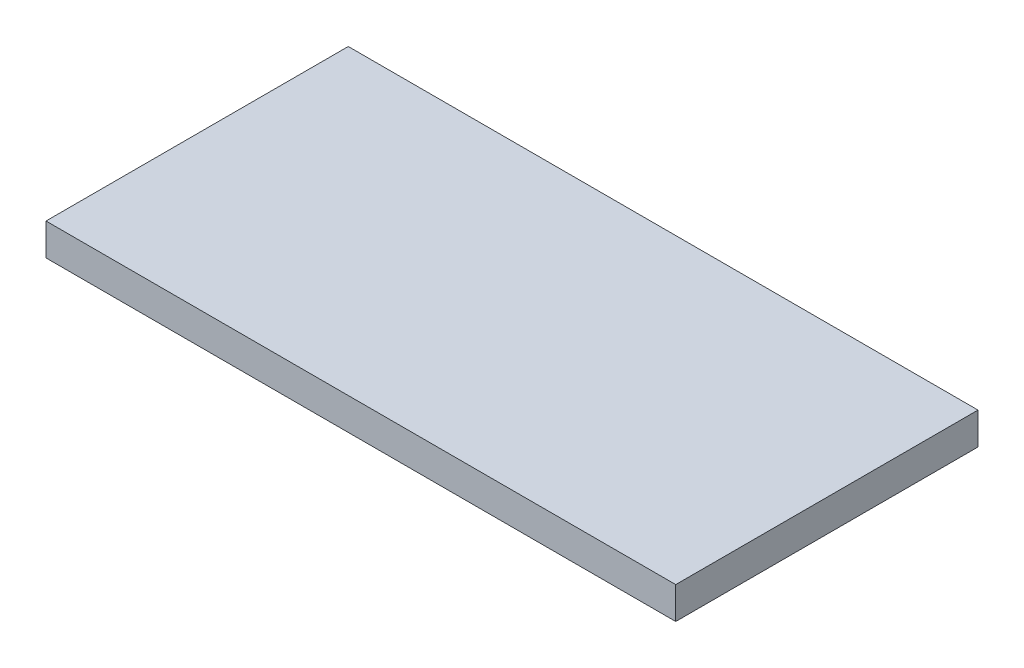
ISO-10303-21;
HEADER;
FILE_DESCRIPTION(('STEP AP214'),'2;1');
FILE_NAME('part.step','',(''),(''),'','','');
FILE_SCHEMA(('AUTOMOTIVE_DESIGN { 1 0 10303 214 1 1 1 1 }'));
ENDSEC;
DATA;
#1=APPLICATION_CONTEXT('core data for automotive mechanical design processes');
#2=APPLICATION_PROTOCOL_DEFINITION('international standard','automotive_design',2000,#1);
#3=PRODUCT_CONTEXT('',#1,'mechanical');
#4=PRODUCT('Part','Part','',(#3));
#5=PRODUCT_RELATED_PRODUCT_CATEGORY('part','',(#4));
#6=PRODUCT_DEFINITION_FORMATION('','',#4);
#7=PRODUCT_DEFINITION_CONTEXT('part definition',#1,'design');
#8=PRODUCT_DEFINITION('design','',#6,#7);
#9=PRODUCT_DEFINITION_SHAPE('','',#8);
#10=(LENGTH_UNIT() NAMED_UNIT(*) SI_UNIT(.MILLI.,.METRE.));
#11=(NAMED_UNIT(*) PLANE_ANGLE_UNIT() SI_UNIT($,.RADIAN.));
#12=(NAMED_UNIT(*) SI_UNIT($,.STERADIAN.) SOLID_ANGLE_UNIT());
#13=UNCERTAINTY_MEASURE_WITH_UNIT(LENGTH_MEASURE(1.E-05),#10,'distance_accuracy_value','');
#14=(GEOMETRIC_REPRESENTATION_CONTEXT(3) GLOBAL_UNCERTAINTY_ASSIGNED_CONTEXT((#13)) GLOBAL_UNIT_ASSIGNED_CONTEXT((#10,
#11,#12)) REPRESENTATION_CONTEXT('',''));
#15=CARTESIAN_POINT('',(0.,0.,0.));
#16=DIRECTION('',(0.,0.,1.));
#17=DIRECTION('',(1.,0.,0.));
#18=AXIS2_PLACEMENT_3D('',#15,#16,#17);
#19=CARTESIAN_POINT('',(187.5,19.05,-90.));
#20=DIRECTION('',(-1.,0.,0.));
#21=DIRECTION('',(0.,0.,1.));
#22=AXIS2_PLACEMENT_3D('',#19,#20,#21);
#23=PLANE('',#22);
#24=DIRECTION('',(0.,0.,-1.));
#25=VECTOR('',#24,1.);
#26=CARTESIAN_POINT('',(187.5,0.,-90.));
#27=LINE('',#26,#25);
#28=CARTESIAN_POINT('',(187.5,0.,90.));
#29=VERTEX_POINT('',#28);
#30=CARTESIAN_POINT('',(187.5,0.,-90.));
#31=VERTEX_POINT('',#30);
#32=EDGE_CURVE('E107',#29,#31,#27,.T.);
#33=ORIENTED_EDGE('',*,*,#32,.T.);
#34=DIRECTION('',(0.,-1.,0.));
#35=VECTOR('',#34,1.);
#36=CARTESIAN_POINT('',(187.5,19.05,-90.));
#37=LINE('',#36,#35);
#38=CARTESIAN_POINT('',(187.5,19.05,-90.));
#39=VERTEX_POINT('',#38);
#40=EDGE_CURVE('E11',#39,#31,#37,.T.);
#41=ORIENTED_EDGE('',*,*,#40,.F.);
#42=DIRECTION('',(0.,0.,-1.));
#43=VECTOR('',#42,1.);
#44=CARTESIAN_POINT('',(187.5,19.05,-90.));
#45=LINE('',#44,#43);
#46=CARTESIAN_POINT('',(187.5,19.05,90.));
#47=VERTEX_POINT('',#46);
#48=EDGE_CURVE('E91',#47,#39,#45,.T.);
#49=ORIENTED_EDGE('',*,*,#48,.F.);
#50=DIRECTION('',(0.,-1.,0.));
#51=VECTOR('',#50,1.);
#52=CARTESIAN_POINT('',(187.5,19.05,90.));
#53=LINE('',#52,#51);
#54=EDGE_CURVE('E103',#47,#29,#53,.T.);
#55=ORIENTED_EDGE('',*,*,#54,.T.);
#56=EDGE_LOOP('',(#33,#41,#49,#55));
#57=FACE_BOUND('',#56,.T.);
#58=ADVANCED_FACE('F39',(#57),#23,.F.);
#59=CARTESIAN_POINT('',(-187.5,19.05,-90.));
#60=DIRECTION('',(0.,0.,1.));
#61=DIRECTION('',(1.,0.,0.));
#62=AXIS2_PLACEMENT_3D('',#59,#60,#61);
#63=PLANE('',#62);
#64=DIRECTION('',(-1.,0.,0.));
#65=VECTOR('',#64,1.);
#66=CARTESIAN_POINT('',(-187.5,0.,-90.));
#67=LINE('',#66,#65);
#68=CARTESIAN_POINT('',(-187.5,0.,-90.));
#69=VERTEX_POINT('',#68);
#70=EDGE_CURVE('E96',#31,#69,#67,.T.);
#71=ORIENTED_EDGE('',*,*,#70,.T.);
#72=DIRECTION('',(0.,-1.,0.));
#73=VECTOR('',#72,1.);
#74=CARTESIAN_POINT('',(-187.5,19.05,-90.));
#75=LINE('',#74,#73);
#76=CARTESIAN_POINT('',(-187.5,19.05,-90.));
#77=VERTEX_POINT('',#76);
#78=EDGE_CURVE('E48',#77,#69,#75,.T.);
#79=ORIENTED_EDGE('',*,*,#78,.F.);
#80=DIRECTION('',(-1.,0.,0.));
#81=VECTOR('',#80,1.);
#82=CARTESIAN_POINT('',(-187.5,19.05,-90.));
#83=LINE('',#82,#81);
#84=EDGE_CURVE('E86',#39,#77,#83,.T.);
#85=ORIENTED_EDGE('',*,*,#84,.F.);
#86=ORIENTED_EDGE('',*,*,#40,.T.);
#87=EDGE_LOOP('',(#71,#79,#85,#86));
#88=FACE_BOUND('',#87,.T.);
#89=ADVANCED_FACE('F95',(#88),#63,.F.);
#90=CARTESIAN_POINT('',(-187.5,19.05,-90.));
#91=DIRECTION('',(1.,0.,0.));
#92=DIRECTION('',(0.,0.,-1.));
#93=AXIS2_PLACEMENT_3D('',#90,#91,#92);
#94=PLANE('',#93);
#95=DIRECTION('',(0.,0.,1.));
#96=VECTOR('',#95,1.);
#97=CARTESIAN_POINT('',(-187.5,0.,-90.));
#98=LINE('',#97,#96);
#99=CARTESIAN_POINT('',(-187.5,0.,90.));
#100=VERTEX_POINT('',#99);
#101=EDGE_CURVE('E73',#69,#100,#98,.T.);
#102=ORIENTED_EDGE('',*,*,#101,.T.);
#103=DIRECTION('',(0.,-1.,0.));
#104=VECTOR('',#103,1.);
#105=CARTESIAN_POINT('',(-187.5,19.05,90.));
#106=LINE('',#105,#104);
#107=CARTESIAN_POINT('',(-187.5,19.05,90.));
#108=VERTEX_POINT('',#107);
#109=EDGE_CURVE('E98',#108,#100,#106,.T.);
#110=ORIENTED_EDGE('',*,*,#109,.F.);
#111=DIRECTION('',(0.,0.,1.));
#112=VECTOR('',#111,1.);
#113=CARTESIAN_POINT('',(-187.5,19.05,-90.));
#114=LINE('',#113,#112);
#115=EDGE_CURVE('E89',#77,#108,#114,.T.);
#116=ORIENTED_EDGE('',*,*,#115,.F.);
#117=ORIENTED_EDGE('',*,*,#78,.T.);
#118=EDGE_LOOP('',(#102,#110,#116,#117));
#119=FACE_BOUND('',#118,.T.);
#120=ADVANCED_FACE('F99',(#119),#94,.F.);
#121=CARTESIAN_POINT('',(-187.5,19.05,90.));
#122=DIRECTION('',(0.,0.,-1.));
#123=DIRECTION('',(-1.,0.,0.));
#124=AXIS2_PLACEMENT_3D('',#121,#122,#123);
#125=PLANE('',#124);
#126=DIRECTION('',(1.,0.,0.));
#127=VECTOR('',#126,1.);
#128=CARTESIAN_POINT('',(-187.5,0.,90.));
#129=LINE('',#128,#127);
#130=EDGE_CURVE('E79',#100,#29,#129,.T.);
#131=ORIENTED_EDGE('',*,*,#130,.T.);
#132=ORIENTED_EDGE('',*,*,#54,.F.);
#133=DIRECTION('',(1.,0.,0.));
#134=VECTOR('',#133,1.);
#135=CARTESIAN_POINT('',(-187.5,19.05,90.));
#136=LINE('',#135,#134);
#137=EDGE_CURVE('E56',#108,#47,#136,.T.);
#138=ORIENTED_EDGE('',*,*,#137,.F.);
#139=ORIENTED_EDGE('',*,*,#109,.T.);
#140=EDGE_LOOP('',(#131,#132,#138,#139));
#141=FACE_BOUND('',#140,.T.);
#142=ADVANCED_FACE('F120',(#141),#125,.F.);
#143=CARTESIAN_POINT('',(0.,19.05,0.));
#144=DIRECTION('',(0.,1.,0.));
#145=DIRECTION('',(0.,0.,1.));
#146=AXIS2_PLACEMENT_3D('',#143,#144,#145);
#147=PLANE('',#146);
#148=ORIENTED_EDGE('',*,*,#48,.T.);
#149=ORIENTED_EDGE('',*,*,#84,.T.);
#150=ORIENTED_EDGE('',*,*,#115,.T.);
#151=ORIENTED_EDGE('',*,*,#137,.T.);
#152=EDGE_LOOP('',(#148,#149,#150,#151));
#153=FACE_BOUND('',#152,.T.);
#154=ADVANCED_FACE('F87',(#153),#147,.T.);
#155=CARTESIAN_POINT('',(0.,0.,0.));
#156=DIRECTION('',(0.,1.,0.));
#157=DIRECTION('',(0.,0.,1.));
#158=AXIS2_PLACEMENT_3D('',#155,#156,#157);
#159=PLANE('',#158);
#160=ORIENTED_EDGE('',*,*,#32,.F.);
#161=ORIENTED_EDGE('',*,*,#130,.F.);
#162=ORIENTED_EDGE('',*,*,#101,.F.);
#163=ORIENTED_EDGE('',*,*,#70,.F.);
#164=EDGE_LOOP('',(#160,#161,#162,#163));
#165=FACE_BOUND('',#164,.T.);
#166=ADVANCED_FACE('F123',(#165),#159,.F.);
#167=CLOSED_SHELL('',(#58,#89,#120,#142,#154,#166));
#168=MANIFOLD_SOLID_BREP('B2',#167);
#169=ADVANCED_BREP_SHAPE_REPRESENTATION('',(#18,#168),#14);
#170=SHAPE_DEFINITION_REPRESENTATION(#9,#169);
ENDSEC;
END-ISO-10303-21;
